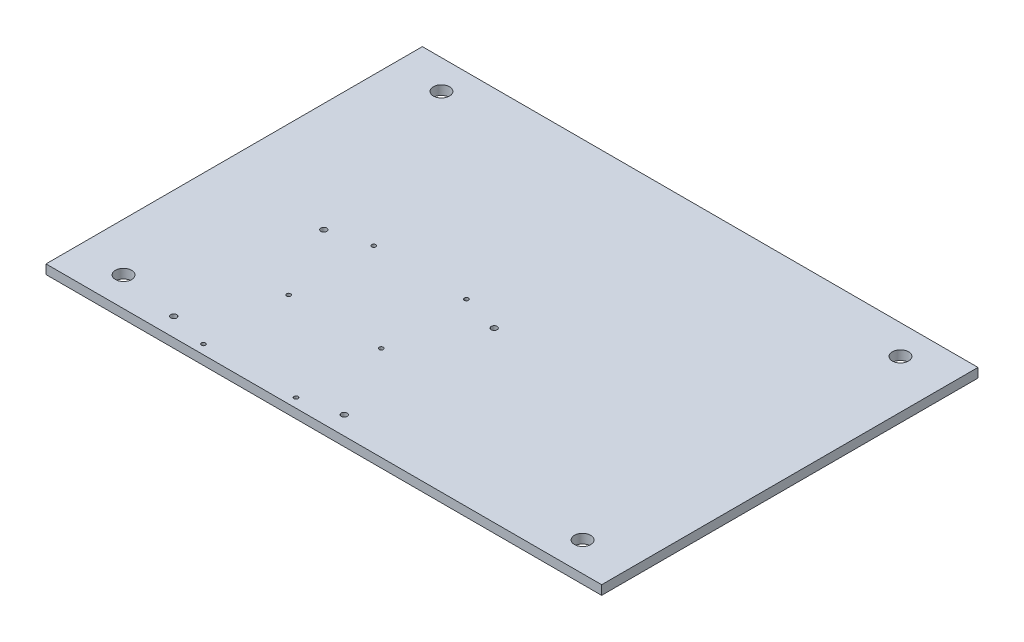
ISO-10303-21;
HEADER;
FILE_DESCRIPTION(('STEP AP214'),'2;1');
FILE_NAME('part.step','',(''),(''),'','','');
FILE_SCHEMA(('AUTOMOTIVE_DESIGN { 1 0 10303 214 1 1 1 1 }'));
ENDSEC;
DATA;
#1=APPLICATION_CONTEXT('core data for automotive mechanical design processes');
#2=APPLICATION_PROTOCOL_DEFINITION('international standard','automotive_design',2000,#1);
#3=PRODUCT_CONTEXT('',#1,'mechanical');
#4=PRODUCT('Part','Part','',(#3));
#5=PRODUCT_RELATED_PRODUCT_CATEGORY('part','',(#4));
#6=PRODUCT_DEFINITION_FORMATION('','',#4);
#7=PRODUCT_DEFINITION_CONTEXT('part definition',#1,'design');
#8=PRODUCT_DEFINITION('design','',#6,#7);
#9=PRODUCT_DEFINITION_SHAPE('','',#8);
#10=(LENGTH_UNIT() NAMED_UNIT(*) SI_UNIT(.MILLI.,.METRE.));
#11=(NAMED_UNIT(*) PLANE_ANGLE_UNIT() SI_UNIT($,.RADIAN.));
#12=(NAMED_UNIT(*) SI_UNIT($,.STERADIAN.) SOLID_ANGLE_UNIT());
#13=UNCERTAINTY_MEASURE_WITH_UNIT(LENGTH_MEASURE(1.E-05),#10,'distance_accuracy_value','');
#14=(GEOMETRIC_REPRESENTATION_CONTEXT(3) GLOBAL_UNCERTAINTY_ASSIGNED_CONTEXT((#13)) GLOBAL_UNIT_ASSIGNED_CONTEXT((#10,
#11,#12)) REPRESENTATION_CONTEXT('',''));
#15=CARTESIAN_POINT('',(0.,0.,0.));
#16=DIRECTION('',(0.,0.,1.));
#17=DIRECTION('',(1.,0.,0.));
#18=AXIS2_PLACEMENT_3D('',#15,#16,#17);
#19=CARTESIAN_POINT('',(0.,5.,0.));
#20=DIRECTION('',(0.,1.,0.));
#21=DIRECTION('',(0.,0.,1.));
#22=AXIS2_PLACEMENT_3D('',#19,#20,#21);
#23=PLANE('',#22);
#24=CARTESIAN_POINT('',(26.0861,5.,15.7861));
#25=DIRECTION('',(0.,1.,0.));
#26=DIRECTION('',(0.,0.,1.));
#27=AXIS2_PLACEMENT_3D('',#24,#25,#26);
#28=CIRCLE('',#27,4.3688);
#29=CARTESIAN_POINT('',(26.0861,5.,20.1549));
#30=VERTEX_POINT('',#29);
#31=EDGE_CURVE('E189',#30,#30,#28,.T.);
#32=ORIENTED_EDGE('',*,*,#31,.F.);
#33=EDGE_LOOP('',(#32));
#34=FACE_BOUND('',#33,.T.);
#35=CARTESIAN_POINT('',(273.9139,5.,15.7861));
#36=DIRECTION('',(0.,1.,0.));
#37=DIRECTION('',(0.,0.,1.));
#38=AXIS2_PLACEMENT_3D('',#35,#36,#37);
#39=CIRCLE('',#38,4.36880000000001);
#40=CARTESIAN_POINT('',(273.9139,5.,20.1549));
#41=VERTEX_POINT('',#40);
#42=EDGE_CURVE('E183',#41,#41,#39,.T.);
#43=ORIENTED_EDGE('',*,*,#42,.F.);
#44=EDGE_LOOP('',(#43));
#45=FACE_BOUND('',#44,.T.);
#46=CARTESIAN_POINT('',(273.9139,5.,187.4139));
#47=DIRECTION('',(0.,1.,0.));
#48=DIRECTION('',(0.,0.,1.));
#49=AXIS2_PLACEMENT_3D('',#46,#47,#48);
#50=CIRCLE('',#49,4.36880000000001);
#51=CARTESIAN_POINT('',(273.9139,5.,191.7827));
#52=VERTEX_POINT('',#51);
#53=EDGE_CURVE('E177',#52,#52,#50,.T.);
#54=ORIENTED_EDGE('',*,*,#53,.F.);
#55=EDGE_LOOP('',(#54));
#56=FACE_BOUND('',#55,.T.);
#57=CARTESIAN_POINT('',(26.0861,5.,187.4139));
#58=DIRECTION('',(0.,1.,0.));
#59=DIRECTION('',(0.,0.,1.));
#60=AXIS2_PLACEMENT_3D('',#57,#58,#59);
#61=CIRCLE('',#60,4.3688);
#62=CARTESIAN_POINT('',(26.0861,5.,191.7827));
#63=VERTEX_POINT('',#62);
#64=EDGE_CURVE('E174',#63,#63,#61,.T.);
#65=ORIENTED_EDGE('',*,*,#64,.F.);
#66=EDGE_LOOP('',(#65));
#67=FACE_BOUND('',#66,.T.);
#68=CARTESIAN_POINT('',(59.,5.,112.2));
#69=DIRECTION('',(0.,1.,0.));
#70=DIRECTION('',(0.,0.,1.));
#71=AXIS2_PLACEMENT_3D('',#68,#69,#70);
#72=CIRCLE('',#71,1.59999999999999);
#73=CARTESIAN_POINT('',(59.,5.,113.8));
#74=VERTEX_POINT('',#73);
#75=EDGE_CURVE('E168',#74,#74,#72,.T.);
#76=ORIENTED_EDGE('',*,*,#75,.F.);
#77=EDGE_LOOP('',(#76));
#78=FACE_BOUND('',#77,.T.);
#79=CARTESIAN_POINT('',(151.,5.,112.2));
#80=DIRECTION('',(0.,1.,0.));
#81=DIRECTION('',(0.,0.,1.));
#82=AXIS2_PLACEMENT_3D('',#79,#80,#81);
#83=CIRCLE('',#82,1.59999999999999);
#84=CARTESIAN_POINT('',(151.,5.,113.8));
#85=VERTEX_POINT('',#84);
#86=EDGE_CURVE('E162',#85,#85,#83,.T.);
#87=ORIENTED_EDGE('',*,*,#86,.F.);
#88=EDGE_LOOP('',(#87));
#89=FACE_BOUND('',#88,.T.);
#90=CARTESIAN_POINT('',(151.,5.,193.2));
#91=DIRECTION('',(0.,1.,0.));
#92=DIRECTION('',(0.,0.,1.));
#93=AXIS2_PLACEMENT_3D('',#90,#91,#92);
#94=CIRCLE('',#93,1.59999999999999);
#95=CARTESIAN_POINT('',(151.,5.,194.8));
#96=VERTEX_POINT('',#95);
#97=EDGE_CURVE('E156',#96,#96,#94,.T.);
#98=ORIENTED_EDGE('',*,*,#97,.F.);
#99=EDGE_LOOP('',(#98));
#100=FACE_BOUND('',#99,.T.);
#101=CARTESIAN_POINT('',(59.,5.,193.2));
#102=DIRECTION('',(0.,1.,0.));
#103=DIRECTION('',(0.,0.,1.));
#104=AXIS2_PLACEMENT_3D('',#101,#102,#103);
#105=CIRCLE('',#104,1.59999999999999);
#106=CARTESIAN_POINT('',(59.,5.,194.8));
#107=VERTEX_POINT('',#106);
#108=EDGE_CURVE('E150',#107,#107,#105,.T.);
#109=ORIENTED_EDGE('',*,*,#108,.F.);
#110=EDGE_LOOP('',(#109));
#111=FACE_BOUND('',#110,.T.);
#112=CARTESIAN_POINT('',(80.,5.,106.2));
#113=DIRECTION('',(0.,1.,0.));
#114=DIRECTION('',(0.,0.,1.));
#115=AXIS2_PLACEMENT_3D('',#112,#113,#114);
#116=CIRCLE('',#115,1.1);
#117=CARTESIAN_POINT('',(80.,5.,107.3));
#118=VERTEX_POINT('',#117);
#119=EDGE_CURVE('E144',#118,#118,#116,.T.);
#120=ORIENTED_EDGE('',*,*,#119,.F.);
#121=EDGE_LOOP('',(#120));
#122=FACE_BOUND('',#121,.T.);
#123=CARTESIAN_POINT('',(130.,5.,106.2));
#124=DIRECTION('',(0.,1.,0.));
#125=DIRECTION('',(0.,0.,1.));
#126=AXIS2_PLACEMENT_3D('',#123,#124,#125);
#127=CIRCLE('',#126,1.09999999999999);
#128=CARTESIAN_POINT('',(130.,5.,107.3));
#129=VERTEX_POINT('',#128);
#130=EDGE_CURVE('E138',#129,#129,#127,.T.);
#131=ORIENTED_EDGE('',*,*,#130,.F.);
#132=EDGE_LOOP('',(#131));
#133=FACE_BOUND('',#132,.T.);
#134=CARTESIAN_POINT('',(130.,5.,152.2));
#135=DIRECTION('',(0.,1.,0.));
#136=DIRECTION('',(0.,0.,1.));
#137=AXIS2_PLACEMENT_3D('',#134,#135,#136);
#138=CIRCLE('',#137,1.09999999999999);
#139=CARTESIAN_POINT('',(130.,5.,153.3));
#140=VERTEX_POINT('',#139);
#141=EDGE_CURVE('E132',#140,#140,#138,.T.);
#142=ORIENTED_EDGE('',*,*,#141,.F.);
#143=EDGE_LOOP('',(#142));
#144=FACE_BOUND('',#143,.T.);
#145=CARTESIAN_POINT('',(80.,5.,152.2));
#146=DIRECTION('',(0.,1.,0.));
#147=DIRECTION('',(0.,0.,1.));
#148=AXIS2_PLACEMENT_3D('',#145,#146,#147);
#149=CIRCLE('',#148,1.1);
#150=CARTESIAN_POINT('',(80.,5.,153.3));
#151=VERTEX_POINT('',#150);
#152=EDGE_CURVE('E126',#151,#151,#149,.T.);
#153=ORIENTED_EDGE('',*,*,#152,.F.);
#154=EDGE_LOOP('',(#153));
#155=FACE_BOUND('',#154,.T.);
#156=CARTESIAN_POINT('',(80.,5.,198.2));
#157=DIRECTION('',(0.,1.,0.));
#158=DIRECTION('',(0.,0.,1.));
#159=AXIS2_PLACEMENT_3D('',#156,#157,#158);
#160=CIRCLE('',#159,1.1);
#161=CARTESIAN_POINT('',(80.,5.,199.3));
#162=VERTEX_POINT('',#161);
#163=EDGE_CURVE('E120',#162,#162,#160,.T.);
#164=ORIENTED_EDGE('',*,*,#163,.F.);
#165=EDGE_LOOP('',(#164));
#166=FACE_BOUND('',#165,.T.);
#167=CARTESIAN_POINT('',(130.,5.,198.2));
#168=DIRECTION('',(0.,1.,0.));
#169=DIRECTION('',(0.,0.,1.));
#170=AXIS2_PLACEMENT_3D('',#167,#168,#169);
#171=CIRCLE('',#170,1.09999999999999);
#172=CARTESIAN_POINT('',(130.,5.,199.3));
#173=VERTEX_POINT('',#172);
#174=EDGE_CURVE('E114',#173,#173,#171,.T.);
#175=ORIENTED_EDGE('',*,*,#174,.F.);
#176=EDGE_LOOP('',(#175));
#177=FACE_BOUND('',#176,.T.);
#178=DIRECTION('',(0.,0.,1.));
#179=VECTOR('',#178,1.);
#180=CARTESIAN_POINT('',(0.,5.,0.));
#181=LINE('',#180,#179);
#182=CARTESIAN_POINT('',(0.,5.,0.));
#183=VERTEX_POINT('',#182);
#184=CARTESIAN_POINT('',(0.,5.,203.2));
#185=VERTEX_POINT('',#184);
#186=EDGE_CURVE('E85',#183,#185,#181,.T.);
#187=ORIENTED_EDGE('',*,*,#186,.T.);
#188=DIRECTION('',(1.,0.,0.));
#189=VECTOR('',#188,1.);
#190=CARTESIAN_POINT('',(0.,5.,203.2));
#191=LINE('',#190,#189);
#192=CARTESIAN_POINT('',(300.,5.,203.2));
#193=VERTEX_POINT('',#192);
#194=EDGE_CURVE('E81',#185,#193,#191,.T.);
#195=ORIENTED_EDGE('',*,*,#194,.T.);
#196=DIRECTION('',(0.,0.,-1.));
#197=VECTOR('',#196,1.);
#198=CARTESIAN_POINT('',(300.,5.,0.));
#199=LINE('',#198,#197);
#200=CARTESIAN_POINT('',(300.,5.,0.));
#201=VERTEX_POINT('',#200);
#202=EDGE_CURVE('E83',#193,#201,#199,.T.);
#203=ORIENTED_EDGE('',*,*,#202,.T.);
#204=DIRECTION('',(-1.,0.,0.));
#205=VECTOR('',#204,1.);
#206=CARTESIAN_POINT('',(0.,5.,0.));
#207=LINE('',#206,#205);
#208=EDGE_CURVE('E51',#201,#183,#207,.T.);
#209=ORIENTED_EDGE('',*,*,#208,.T.);
#210=EDGE_LOOP('',(#187,#195,#203,#209));
#211=FACE_BOUND('',#210,.T.);
#212=ADVANCED_FACE('F33',(#34,#45,#56,#67,#78,#89,#100,#111,#122,#133,#144,#155,#166,#177,#211),
#23,.T.);
#213=CARTESIAN_POINT('',(0.,0.,0.));
#214=DIRECTION('',(0.,1.,0.));
#215=DIRECTION('',(0.,0.,1.));
#216=AXIS2_PLACEMENT_3D('',#213,#214,#215);
#217=PLANE('',#216);
#218=CARTESIAN_POINT('',(26.0861,0.,15.7861));
#219=DIRECTION('',(0.,1.,0.));
#220=DIRECTION('',(0.,0.,1.));
#221=AXIS2_PLACEMENT_3D('',#218,#219,#220);
#222=CIRCLE('',#221,4.36879999999999);
#223=CARTESIAN_POINT('',(26.0861,0.,20.1549));
#224=VERTEX_POINT('',#223);
#225=EDGE_CURVE('E186',#224,#224,#222,.T.);
#226=ORIENTED_EDGE('',*,*,#225,.T.);
#227=EDGE_LOOP('',(#226));
#228=FACE_BOUND('',#227,.T.);
#229=CARTESIAN_POINT('',(273.9139,0.,15.7861));
#230=DIRECTION('',(0.,1.,0.));
#231=DIRECTION('',(0.,0.,1.));
#232=AXIS2_PLACEMENT_3D('',#229,#230,#231);
#233=CIRCLE('',#232,4.36880000000001);
#234=CARTESIAN_POINT('',(273.9139,0.,20.1549));
#235=VERTEX_POINT('',#234);
#236=EDGE_CURVE('E180',#235,#235,#233,.T.);
#237=ORIENTED_EDGE('',*,*,#236,.T.);
#238=EDGE_LOOP('',(#237));
#239=FACE_BOUND('',#238,.T.);
#240=CARTESIAN_POINT('',(273.9139,0.,187.4139));
#241=DIRECTION('',(0.,1.,0.));
#242=DIRECTION('',(0.,0.,1.));
#243=AXIS2_PLACEMENT_3D('',#240,#241,#242);
#244=CIRCLE('',#243,4.36880000000001);
#245=CARTESIAN_POINT('',(273.9139,0.,191.7827));
#246=VERTEX_POINT('',#245);
#247=EDGE_CURVE('E37',#246,#246,#244,.T.);
#248=ORIENTED_EDGE('',*,*,#247,.T.);
#249=EDGE_LOOP('',(#248));
#250=FACE_BOUND('',#249,.T.);
#251=CARTESIAN_POINT('',(26.0861,0.,187.4139));
#252=DIRECTION('',(0.,1.,0.));
#253=DIRECTION('',(0.,0.,1.));
#254=AXIS2_PLACEMENT_3D('',#251,#252,#253);
#255=CIRCLE('',#254,4.36879999999999);
#256=CARTESIAN_POINT('',(26.0861,0.,191.7827));
#257=VERTEX_POINT('',#256);
#258=EDGE_CURVE('E171',#257,#257,#255,.T.);
#259=ORIENTED_EDGE('',*,*,#258,.T.);
#260=EDGE_LOOP('',(#259));
#261=FACE_BOUND('',#260,.T.);
#262=CARTESIAN_POINT('',(59.,0.,112.2));
#263=DIRECTION('',(0.,1.,0.));
#264=DIRECTION('',(0.,0.,1.));
#265=AXIS2_PLACEMENT_3D('',#262,#263,#264);
#266=CIRCLE('',#265,1.59999999999999);
#267=CARTESIAN_POINT('',(59.,0.,113.8));
#268=VERTEX_POINT('',#267);
#269=EDGE_CURVE('E165',#268,#268,#266,.T.);
#270=ORIENTED_EDGE('',*,*,#269,.T.);
#271=EDGE_LOOP('',(#270));
#272=FACE_BOUND('',#271,.T.);
#273=CARTESIAN_POINT('',(151.,0.,112.2));
#274=DIRECTION('',(0.,1.,0.));
#275=DIRECTION('',(0.,0.,1.));
#276=AXIS2_PLACEMENT_3D('',#273,#274,#275);
#277=CIRCLE('',#276,1.59999999999999);
#278=CARTESIAN_POINT('',(151.,0.,113.8));
#279=VERTEX_POINT('',#278);
#280=EDGE_CURVE('E159',#279,#279,#277,.T.);
#281=ORIENTED_EDGE('',*,*,#280,.T.);
#282=EDGE_LOOP('',(#281));
#283=FACE_BOUND('',#282,.T.);
#284=CARTESIAN_POINT('',(151.,0.,193.2));
#285=DIRECTION('',(0.,1.,0.));
#286=DIRECTION('',(0.,0.,1.));
#287=AXIS2_PLACEMENT_3D('',#284,#285,#286);
#288=CIRCLE('',#287,1.59999999999999);
#289=CARTESIAN_POINT('',(151.,0.,194.8));
#290=VERTEX_POINT('',#289);
#291=EDGE_CURVE('E153',#290,#290,#288,.T.);
#292=ORIENTED_EDGE('',*,*,#291,.T.);
#293=EDGE_LOOP('',(#292));
#294=FACE_BOUND('',#293,.T.);
#295=CARTESIAN_POINT('',(59.,0.,193.2));
#296=DIRECTION('',(0.,1.,0.));
#297=DIRECTION('',(0.,0.,1.));
#298=AXIS2_PLACEMENT_3D('',#295,#296,#297);
#299=CIRCLE('',#298,1.59999999999999);
#300=CARTESIAN_POINT('',(59.,0.,194.8));
#301=VERTEX_POINT('',#300);
#302=EDGE_CURVE('E147',#301,#301,#299,.T.);
#303=ORIENTED_EDGE('',*,*,#302,.T.);
#304=EDGE_LOOP('',(#303));
#305=FACE_BOUND('',#304,.T.);
#306=CARTESIAN_POINT('',(80.,0.,106.2));
#307=DIRECTION('',(0.,1.,0.));
#308=DIRECTION('',(0.,0.,1.));
#309=AXIS2_PLACEMENT_3D('',#306,#307,#308);
#310=CIRCLE('',#309,1.1);
#311=CARTESIAN_POINT('',(80.,0.,107.3));
#312=VERTEX_POINT('',#311);
#313=EDGE_CURVE('E141',#312,#312,#310,.T.);
#314=ORIENTED_EDGE('',*,*,#313,.T.);
#315=EDGE_LOOP('',(#314));
#316=FACE_BOUND('',#315,.T.);
#317=CARTESIAN_POINT('',(130.,0.,106.2));
#318=DIRECTION('',(0.,1.,0.));
#319=DIRECTION('',(0.,0.,1.));
#320=AXIS2_PLACEMENT_3D('',#317,#318,#319);
#321=CIRCLE('',#320,1.09999999999999);
#322=CARTESIAN_POINT('',(130.,0.,107.3));
#323=VERTEX_POINT('',#322);
#324=EDGE_CURVE('E135',#323,#323,#321,.T.);
#325=ORIENTED_EDGE('',*,*,#324,.T.);
#326=EDGE_LOOP('',(#325));
#327=FACE_BOUND('',#326,.T.);
#328=CARTESIAN_POINT('',(130.,0.,152.2));
#329=DIRECTION('',(0.,1.,0.));
#330=DIRECTION('',(0.,0.,1.));
#331=AXIS2_PLACEMENT_3D('',#328,#329,#330);
#332=CIRCLE('',#331,1.09999999999999);
#333=CARTESIAN_POINT('',(130.,0.,153.3));
#334=VERTEX_POINT('',#333);
#335=EDGE_CURVE('E129',#334,#334,#332,.T.);
#336=ORIENTED_EDGE('',*,*,#335,.T.);
#337=EDGE_LOOP('',(#336));
#338=FACE_BOUND('',#337,.T.);
#339=CARTESIAN_POINT('',(80.,0.,152.2));
#340=DIRECTION('',(0.,1.,0.));
#341=DIRECTION('',(0.,0.,1.));
#342=AXIS2_PLACEMENT_3D('',#339,#340,#341);
#343=CIRCLE('',#342,1.1);
#344=CARTESIAN_POINT('',(80.,0.,153.3));
#345=VERTEX_POINT('',#344);
#346=EDGE_CURVE('E123',#345,#345,#343,.T.);
#347=ORIENTED_EDGE('',*,*,#346,.T.);
#348=EDGE_LOOP('',(#347));
#349=FACE_BOUND('',#348,.T.);
#350=CARTESIAN_POINT('',(80.,0.,198.2));
#351=DIRECTION('',(0.,1.,0.));
#352=DIRECTION('',(0.,0.,1.));
#353=AXIS2_PLACEMENT_3D('',#350,#351,#352);
#354=CIRCLE('',#353,1.1);
#355=CARTESIAN_POINT('',(80.,0.,199.3));
#356=VERTEX_POINT('',#355);
#357=EDGE_CURVE('E117',#356,#356,#354,.T.);
#358=ORIENTED_EDGE('',*,*,#357,.T.);
#359=EDGE_LOOP('',(#358));
#360=FACE_BOUND('',#359,.T.);
#361=CARTESIAN_POINT('',(130.,0.,198.2));
#362=DIRECTION('',(0.,1.,0.));
#363=DIRECTION('',(0.,0.,1.));
#364=AXIS2_PLACEMENT_3D('',#361,#362,#363);
#365=CIRCLE('',#364,1.09999999999999);
#366=CARTESIAN_POINT('',(130.,0.,199.3));
#367=VERTEX_POINT('',#366);
#368=EDGE_CURVE('E101',#367,#367,#365,.T.);
#369=ORIENTED_EDGE('',*,*,#368,.T.);
#370=EDGE_LOOP('',(#369));
#371=FACE_BOUND('',#370,.T.);
#372=DIRECTION('',(0.,0.,1.));
#373=VECTOR('',#372,1.);
#374=CARTESIAN_POINT('',(0.,0.,0.));
#375=LINE('',#374,#373);
#376=CARTESIAN_POINT('',(0.,0.,0.));
#377=VERTEX_POINT('',#376);
#378=CARTESIAN_POINT('',(0.,0.,203.2));
#379=VERTEX_POINT('',#378);
#380=EDGE_CURVE('E98',#377,#379,#375,.T.);
#381=ORIENTED_EDGE('',*,*,#380,.F.);
#382=DIRECTION('',(-1.,0.,0.));
#383=VECTOR('',#382,1.);
#384=CARTESIAN_POINT('',(0.,0.,0.));
#385=LINE('',#384,#383);
#386=CARTESIAN_POINT('',(300.,0.,0.));
#387=VERTEX_POINT('',#386);
#388=EDGE_CURVE('E74',#387,#377,#385,.T.);
#389=ORIENTED_EDGE('',*,*,#388,.F.);
#390=DIRECTION('',(0.,0.,-1.));
#391=VECTOR('',#390,1.);
#392=CARTESIAN_POINT('',(300.,0.,0.));
#393=LINE('',#392,#391);
#394=CARTESIAN_POINT('',(300.,0.,203.2));
#395=VERTEX_POINT('',#394);
#396=EDGE_CURVE('E68',#395,#387,#393,.T.);
#397=ORIENTED_EDGE('',*,*,#396,.F.);
#398=DIRECTION('',(1.,0.,0.));
#399=VECTOR('',#398,1.);
#400=CARTESIAN_POINT('',(0.,0.,203.2));
#401=LINE('',#400,#399);
#402=EDGE_CURVE('E89',#379,#395,#401,.T.);
#403=ORIENTED_EDGE('',*,*,#402,.F.);
#404=EDGE_LOOP('',(#381,#389,#397,#403));
#405=FACE_BOUND('',#404,.T.);
#406=ADVANCED_FACE('F109',(#228,#239,#250,#261,#272,#283,#294,#305,#316,#327,#338,#349,#360,
#371,#405),#217,.F.);
#407=CARTESIAN_POINT('',(0.,5.,0.));
#408=DIRECTION('',(1.,0.,0.));
#409=DIRECTION('',(0.,0.,-1.));
#410=AXIS2_PLACEMENT_3D('',#407,#408,#409);
#411=PLANE('',#410);
#412=ORIENTED_EDGE('',*,*,#380,.T.);
#413=DIRECTION('',(0.,-1.,0.));
#414=VECTOR('',#413,1.);
#415=CARTESIAN_POINT('',(0.,5.,203.2));
#416=LINE('',#415,#414);
#417=EDGE_CURVE('E11',#185,#379,#416,.T.);
#418=ORIENTED_EDGE('',*,*,#417,.F.);
#419=ORIENTED_EDGE('',*,*,#186,.F.);
#420=DIRECTION('',(0.,-1.,0.));
#421=VECTOR('',#420,1.);
#422=CARTESIAN_POINT('',(0.,5.,0.));
#423=LINE('',#422,#421);
#424=EDGE_CURVE('E94',#183,#377,#423,.T.);
#425=ORIENTED_EDGE('',*,*,#424,.T.);
#426=EDGE_LOOP('',(#412,#418,#419,#425));
#427=FACE_BOUND('',#426,.T.);
#428=ADVANCED_FACE('F35',(#427),#411,.F.);
#429=CARTESIAN_POINT('',(0.,5.,203.2));
#430=DIRECTION('',(0.,0.,-1.));
#431=DIRECTION('',(-1.,0.,0.));
#432=AXIS2_PLACEMENT_3D('',#429,#430,#431);
#433=PLANE('',#432);
#434=ORIENTED_EDGE('',*,*,#402,.T.);
#435=DIRECTION('',(0.,-1.,0.));
#436=VECTOR('',#435,1.);
#437=CARTESIAN_POINT('',(300.,5.,203.2));
#438=LINE('',#437,#436);
#439=EDGE_CURVE('E43',#193,#395,#438,.T.);
#440=ORIENTED_EDGE('',*,*,#439,.F.);
#441=ORIENTED_EDGE('',*,*,#194,.F.);
#442=ORIENTED_EDGE('',*,*,#417,.T.);
#443=EDGE_LOOP('',(#434,#440,#441,#442));
#444=FACE_BOUND('',#443,.T.);
#445=ADVANCED_FACE('F88',(#444),#433,.F.);
#446=CARTESIAN_POINT('',(300.,5.,0.));
#447=DIRECTION('',(-1.,0.,0.));
#448=DIRECTION('',(0.,0.,1.));
#449=AXIS2_PLACEMENT_3D('',#446,#447,#448);
#450=PLANE('',#449);
#451=ORIENTED_EDGE('',*,*,#396,.T.);
#452=DIRECTION('',(0.,-1.,0.));
#453=VECTOR('',#452,1.);
#454=CARTESIAN_POINT('',(300.,5.,0.));
#455=LINE('',#454,#453);
#456=EDGE_CURVE('E90',#201,#387,#455,.T.);
#457=ORIENTED_EDGE('',*,*,#456,.F.);
#458=ORIENTED_EDGE('',*,*,#202,.F.);
#459=ORIENTED_EDGE('',*,*,#439,.T.);
#460=EDGE_LOOP('',(#451,#457,#458,#459));
#461=FACE_BOUND('',#460,.T.);
#462=ADVANCED_FACE('F92',(#461),#450,.F.);
#463=CARTESIAN_POINT('',(0.,5.,0.));
#464=DIRECTION('',(0.,0.,1.));
#465=DIRECTION('',(1.,0.,0.));
#466=AXIS2_PLACEMENT_3D('',#463,#464,#465);
#467=PLANE('',#466);
#468=ORIENTED_EDGE('',*,*,#388,.T.);
#469=ORIENTED_EDGE('',*,*,#424,.F.);
#470=ORIENTED_EDGE('',*,*,#208,.F.);
#471=ORIENTED_EDGE('',*,*,#456,.T.);
#472=EDGE_LOOP('',(#468,#469,#470,#471));
#473=FACE_BOUND('',#472,.T.);
#474=ADVANCED_FACE('F106',(#473),#467,.F.);
#475=CARTESIAN_POINT('',(130.,5.,198.2));
#476=DIRECTION('',(0.,1.,0.));
#477=DIRECTION('',(0.,0.,1.));
#478=AXIS2_PLACEMENT_3D('',#475,#476,#477);
#479=CYLINDRICAL_SURFACE('',#478,1.09999999999999);
#480=ORIENTED_EDGE('',*,*,#368,.F.);
#481=EDGE_LOOP('',(#480));
#482=FACE_BOUND('',#481,.T.);
#483=ORIENTED_EDGE('',*,*,#174,.T.);
#484=EDGE_LOOP('',(#483));
#485=FACE_BOUND('',#484,.T.);
#486=ADVANCED_FACE('F225',(#482,#485),#479,.F.);
#487=CARTESIAN_POINT('',(80.,5.,198.2));
#488=DIRECTION('',(0.,1.,0.));
#489=DIRECTION('',(0.,0.,1.));
#490=AXIS2_PLACEMENT_3D('',#487,#488,#489);
#491=CYLINDRICAL_SURFACE('',#490,1.1);
#492=ORIENTED_EDGE('',*,*,#357,.F.);
#493=EDGE_LOOP('',(#492));
#494=FACE_BOUND('',#493,.T.);
#495=ORIENTED_EDGE('',*,*,#163,.T.);
#496=EDGE_LOOP('',(#495));
#497=FACE_BOUND('',#496,.T.);
#498=ADVANCED_FACE('F227',(#494,#497),#491,.F.);
#499=CARTESIAN_POINT('',(80.,5.,152.2));
#500=DIRECTION('',(0.,1.,0.));
#501=DIRECTION('',(0.,0.,1.));
#502=AXIS2_PLACEMENT_3D('',#499,#500,#501);
#503=CYLINDRICAL_SURFACE('',#502,1.1);
#504=ORIENTED_EDGE('',*,*,#346,.F.);
#505=EDGE_LOOP('',(#504));
#506=FACE_BOUND('',#505,.T.);
#507=ORIENTED_EDGE('',*,*,#152,.T.);
#508=EDGE_LOOP('',(#507));
#509=FACE_BOUND('',#508,.T.);
#510=ADVANCED_FACE('F234',(#506,#509),#503,.F.);
#511=CARTESIAN_POINT('',(130.,5.,152.2));
#512=DIRECTION('',(0.,1.,0.));
#513=DIRECTION('',(0.,0.,1.));
#514=AXIS2_PLACEMENT_3D('',#511,#512,#513);
#515=CYLINDRICAL_SURFACE('',#514,1.09999999999999);
#516=ORIENTED_EDGE('',*,*,#335,.F.);
#517=EDGE_LOOP('',(#516));
#518=FACE_BOUND('',#517,.T.);
#519=ORIENTED_EDGE('',*,*,#141,.T.);
#520=EDGE_LOOP('',(#519));
#521=FACE_BOUND('',#520,.T.);
#522=ADVANCED_FACE('F324',(#518,#521),#515,.F.);
#523=CARTESIAN_POINT('',(130.,5.,106.2));
#524=DIRECTION('',(0.,1.,0.));
#525=DIRECTION('',(0.,0.,1.));
#526=AXIS2_PLACEMENT_3D('',#523,#524,#525);
#527=CYLINDRICAL_SURFACE('',#526,1.09999999999999);
#528=ORIENTED_EDGE('',*,*,#324,.F.);
#529=EDGE_LOOP('',(#528));
#530=FACE_BOUND('',#529,.T.);
#531=ORIENTED_EDGE('',*,*,#130,.T.);
#532=EDGE_LOOP('',(#531));
#533=FACE_BOUND('',#532,.T.);
#534=ADVANCED_FACE('F314',(#530,#533),#527,.F.);
#535=CARTESIAN_POINT('',(80.,5.,106.2));
#536=DIRECTION('',(0.,1.,0.));
#537=DIRECTION('',(0.,0.,1.));
#538=AXIS2_PLACEMENT_3D('',#535,#536,#537);
#539=CYLINDRICAL_SURFACE('',#538,1.1);
#540=ORIENTED_EDGE('',*,*,#313,.F.);
#541=EDGE_LOOP('',(#540));
#542=FACE_BOUND('',#541,.T.);
#543=ORIENTED_EDGE('',*,*,#119,.T.);
#544=EDGE_LOOP('',(#543));
#545=FACE_BOUND('',#544,.T.);
#546=ADVANCED_FACE('F304',(#542,#545),#539,.F.);
#547=CARTESIAN_POINT('',(59.,5.,193.2));
#548=DIRECTION('',(0.,1.,0.));
#549=DIRECTION('',(0.,0.,1.));
#550=AXIS2_PLACEMENT_3D('',#547,#548,#549);
#551=CYLINDRICAL_SURFACE('',#550,1.59999999999999);
#552=ORIENTED_EDGE('',*,*,#302,.F.);
#553=EDGE_LOOP('',(#552));
#554=FACE_BOUND('',#553,.T.);
#555=ORIENTED_EDGE('',*,*,#108,.T.);
#556=EDGE_LOOP('',(#555));
#557=FACE_BOUND('',#556,.T.);
#558=ADVANCED_FACE('F294',(#554,#557),#551,.F.);
#559=CARTESIAN_POINT('',(151.,5.,193.2));
#560=DIRECTION('',(0.,1.,0.));
#561=DIRECTION('',(0.,0.,1.));
#562=AXIS2_PLACEMENT_3D('',#559,#560,#561);
#563=CYLINDRICAL_SURFACE('',#562,1.59999999999999);
#564=ORIENTED_EDGE('',*,*,#291,.F.);
#565=EDGE_LOOP('',(#564));
#566=FACE_BOUND('',#565,.T.);
#567=ORIENTED_EDGE('',*,*,#97,.T.);
#568=EDGE_LOOP('',(#567));
#569=FACE_BOUND('',#568,.T.);
#570=ADVANCED_FACE('F284',(#566,#569),#563,.F.);
#571=CARTESIAN_POINT('',(151.,5.,112.2));
#572=DIRECTION('',(0.,1.,0.));
#573=DIRECTION('',(0.,0.,1.));
#574=AXIS2_PLACEMENT_3D('',#571,#572,#573);
#575=CYLINDRICAL_SURFACE('',#574,1.59999999999999);
#576=ORIENTED_EDGE('',*,*,#280,.F.);
#577=EDGE_LOOP('',(#576));
#578=FACE_BOUND('',#577,.T.);
#579=ORIENTED_EDGE('',*,*,#86,.T.);
#580=EDGE_LOOP('',(#579));
#581=FACE_BOUND('',#580,.T.);
#582=ADVANCED_FACE('F272',(#578,#581),#575,.F.);
#583=CARTESIAN_POINT('',(59.,5.,112.2));
#584=DIRECTION('',(0.,1.,0.));
#585=DIRECTION('',(0.,0.,1.));
#586=AXIS2_PLACEMENT_3D('',#583,#584,#585);
#587=CYLINDRICAL_SURFACE('',#586,1.59999999999999);
#588=ORIENTED_EDGE('',*,*,#269,.F.);
#589=EDGE_LOOP('',(#588));
#590=FACE_BOUND('',#589,.T.);
#591=ORIENTED_EDGE('',*,*,#75,.T.);
#592=EDGE_LOOP('',(#591));
#593=FACE_BOUND('',#592,.T.);
#594=ADVANCED_FACE('F266',(#590,#593),#587,.F.);
#595=CARTESIAN_POINT('',(26.0861,5.,187.4139));
#596=DIRECTION('',(0.,1.,0.));
#597=DIRECTION('',(0.,0.,1.));
#598=AXIS2_PLACEMENT_3D('',#595,#596,#597);
#599=CYLINDRICAL_SURFACE('',#598,4.36879999999999);
#600=ORIENTED_EDGE('',*,*,#64,.T.);
#601=EDGE_LOOP('',(#600));
#602=FACE_BOUND('',#601,.T.);
#603=ORIENTED_EDGE('',*,*,#258,.F.);
#604=EDGE_LOOP('',(#603));
#605=FACE_BOUND('',#604,.T.);
#606=ADVANCED_FACE('F271',(#602,#605),#599,.F.);
#607=CARTESIAN_POINT('',(273.9139,5.,187.4139));
#608=DIRECTION('',(0.,1.,0.));
#609=DIRECTION('',(0.,0.,1.));
#610=AXIS2_PLACEMENT_3D('',#607,#608,#609);
#611=CYLINDRICAL_SURFACE('',#610,4.36880000000001);
#612=ORIENTED_EDGE('',*,*,#53,.T.);
#613=EDGE_LOOP('',(#612));
#614=FACE_BOUND('',#613,.T.);
#615=ORIENTED_EDGE('',*,*,#247,.F.);
#616=EDGE_LOOP('',(#615));
#617=FACE_BOUND('',#616,.T.);
#618=ADVANCED_FACE('F379',(#614,#617),#611,.F.);
#619=CARTESIAN_POINT('',(273.9139,5.,15.7861));
#620=DIRECTION('',(0.,1.,0.));
#621=DIRECTION('',(0.,0.,1.));
#622=AXIS2_PLACEMENT_3D('',#619,#620,#621);
#623=CYLINDRICAL_SURFACE('',#622,4.36880000000001);
#624=ORIENTED_EDGE('',*,*,#42,.T.);
#625=EDGE_LOOP('',(#624));
#626=FACE_BOUND('',#625,.T.);
#627=ORIENTED_EDGE('',*,*,#236,.F.);
#628=EDGE_LOOP('',(#627));
#629=FACE_BOUND('',#628,.T.);
#630=ADVANCED_FACE('F383',(#626,#629),#623,.F.);
#631=CARTESIAN_POINT('',(26.0861,5.,15.7861));
#632=DIRECTION('',(0.,1.,0.));
#633=DIRECTION('',(0.,0.,1.));
#634=AXIS2_PLACEMENT_3D('',#631,#632,#633);
#635=CYLINDRICAL_SURFACE('',#634,4.36879999999999);
#636=ORIENTED_EDGE('',*,*,#31,.T.);
#637=EDGE_LOOP('',(#636));
#638=FACE_BOUND('',#637,.T.);
#639=ORIENTED_EDGE('',*,*,#225,.F.);
#640=EDGE_LOOP('',(#639));
#641=FACE_BOUND('',#640,.T.);
#642=ADVANCED_FACE('F193',(#638,#641),#635,.F.);
#643=CLOSED_SHELL('',(#212,#406,#428,#445,#462,#474,#486,#498,#510,#522,#534,#546,#558,#570,
#582,#594,#606,#618,#630,#642));
#644=MANIFOLD_SOLID_BREP('B2',#643);
#645=ADVANCED_BREP_SHAPE_REPRESENTATION('',(#18,#644),#14);
#646=SHAPE_DEFINITION_REPRESENTATION(#9,#645);
ENDSEC;
END-ISO-10303-21;
